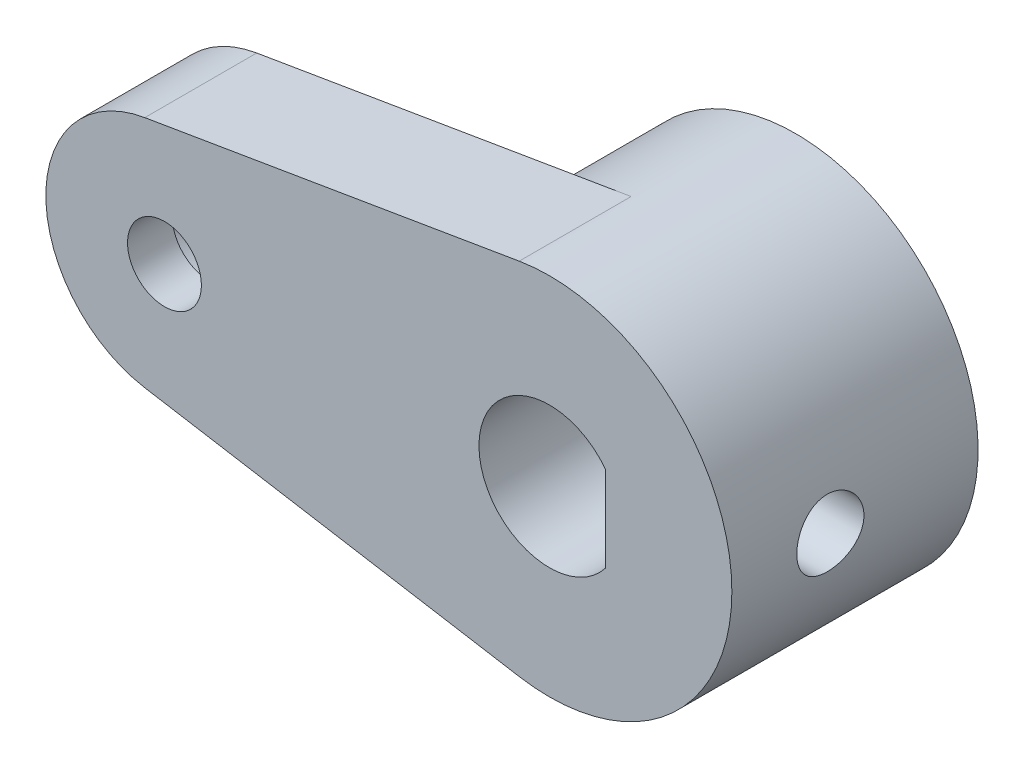
ISO-10303-21;
HEADER;
FILE_DESCRIPTION(('STEP AP214'),'2;1');
FILE_NAME('part.step','',(''),(''),'','','');
FILE_SCHEMA(('AUTOMOTIVE_DESIGN { 1 0 10303 214 1 1 1 1 }'));
ENDSEC;
DATA;
#1=APPLICATION_CONTEXT('core data for automotive mechanical design processes');
#2=APPLICATION_PROTOCOL_DEFINITION('international standard','automotive_design',2000,#1);
#3=PRODUCT_CONTEXT('',#1,'mechanical');
#4=PRODUCT('Part','Part','',(#3));
#5=PRODUCT_RELATED_PRODUCT_CATEGORY('part','',(#4));
#6=PRODUCT_DEFINITION_FORMATION('','',#4);
#7=PRODUCT_DEFINITION_CONTEXT('part definition',#1,'design');
#8=PRODUCT_DEFINITION('design','',#6,#7);
#9=PRODUCT_DEFINITION_SHAPE('','',#8);
#10=(LENGTH_UNIT() NAMED_UNIT(*) SI_UNIT(.MILLI.,.METRE.));
#11=(NAMED_UNIT(*) PLANE_ANGLE_UNIT() SI_UNIT($,.RADIAN.));
#12=(NAMED_UNIT(*) SI_UNIT($,.STERADIAN.) SOLID_ANGLE_UNIT());
#13=UNCERTAINTY_MEASURE_WITH_UNIT(LENGTH_MEASURE(1.E-05),#10,'distance_accuracy_value','');
#14=(GEOMETRIC_REPRESENTATION_CONTEXT(3) GLOBAL_UNCERTAINTY_ASSIGNED_CONTEXT((#13)) GLOBAL_UNIT_ASSIGNED_CONTEXT((#10,
#11,#12)) REPRESENTATION_CONTEXT('',''));
#15=CARTESIAN_POINT('',(0.,0.,0.));
#16=DIRECTION('',(0.,0.,1.));
#17=DIRECTION('',(1.,0.,0.));
#18=AXIS2_PLACEMENT_3D('',#15,#16,#17);
#19=CARTESIAN_POINT('',(-12.05,15.9999999999999,0.));
#20=DIRECTION('',(0.,0.,1.));
#21=DIRECTION('',(1.,0.,0.));
#22=AXIS2_PLACEMENT_3D('',#19,#20,#21);
#23=PLANE('',#22);
#24=CARTESIAN_POINT('',(-29.25,15.9999999999999,0.));
#25=DIRECTION('',(0.,0.,1.));
#26=DIRECTION('',(1.,0.,0.));
#27=AXIS2_PLACEMENT_3D('',#24,#25,#26);
#28=CIRCLE('',#27,1.65);
#29=CARTESIAN_POINT('',(-27.6,15.9999999999999,0.));
#30=VERTEX_POINT('',#29);
#31=EDGE_CURVE('E274',#30,#30,#28,.T.);
#32=ORIENTED_EDGE('',*,*,#31,.T.);
#33=EDGE_LOOP('',(#32));
#34=FACE_BOUND('',#33,.T.);
#35=CARTESIAN_POINT('',(-29.2499999999964,15.9999999999999,0.));
#36=DIRECTION('',(0.,0.,-1.));
#37=DIRECTION('',(-1.,0.,0.));
#38=AXIS2_PLACEMENT_3D('',#35,#36,#37);
#39=CIRCLE('',#38,2.9);
#40=CARTESIAN_POINT('',(-32.1499999999964,15.9999999999999,0.));
#41=VERTEX_POINT('',#40);
#42=EDGE_CURVE('E180',#41,#41,#39,.T.);
#43=ORIENTED_EDGE('',*,*,#42,.T.);
#44=EDGE_LOOP('',(#43));
#45=FACE_BOUND('',#44,.T.);
#46=ADVANCED_FACE('F36',(#34,#45),#23,.F.);
#47=CARTESIAN_POINT('',(-12.05,15.9999999999999,2.));
#48=DIRECTION('',(0.,0.,-1.));
#49=DIRECTION('',(-1.,0.,0.));
#50=AXIS2_PLACEMENT_3D('',#47,#48,#49);
#51=CYLINDRICAL_SURFACE('',#50,3.15);
#52=DIRECTION('',(0.,0.,-1.));
#53=VECTOR('',#52,1.);
#54=CARTESIAN_POINT('',(-11.55,19.1100643080166,2.));
#55=LINE('',#54,#53);
#56=CARTESIAN_POINT('',(-11.55,19.1100643080166,-1.98560429361376));
#57=VERTEX_POINT('',#56);
#58=CARTESIAN_POINT('',(-11.55,19.1100643080166,-2.81676591174198));
#59=VERTEX_POINT('',#58);
#60=EDGE_CURVE('E11',#57,#59,#55,.T.);
#61=ORIENTED_EDGE('',*,*,#60,.F.);
#62=CARTESIAN_POINT('',(-12.05,15.9999999999999,3.40118510267787));
#63=DIRECTION('',(0.,-0.866025403784438,-0.5));
#64=DIRECTION('',(0.,0.5,-0.866025403784438));
#65=AXIS2_PLACEMENT_3D('',#62,#63,#64);
#66=ELLIPSE('',#65,6.29999999999999,3.15);
#67=CARTESIAN_POINT('',(-9.55000000000003,17.9163767896735,0.0819231365173246));
#68=VERTEX_POINT('',#67);
#69=EDGE_CURVE('E556',#57,#68,#66,.T.);
#70=ORIENTED_EDGE('',*,*,#69,.T.);
#71=DIRECTION('',(0.,0.,1.));
#72=VECTOR('',#71,1.);
#73=CARTESIAN_POINT('',(-9.55000000000003,17.9163767896735,-13.0065565042295));
#74=LINE('',#73,#72);
#75=CARTESIAN_POINT('',(-9.55000000000003,17.9163767896735,2.));
#76=VERTEX_POINT('',#75);
#77=EDGE_CURVE('E59',#68,#76,#74,.T.);
#78=ORIENTED_EDGE('',*,*,#77,.T.);
#79=CARTESIAN_POINT('',(-12.05,15.9999999999999,2.));
#80=DIRECTION('',(0.,0.,1.));
#81=DIRECTION('',(1.,0.,0.));
#82=AXIS2_PLACEMENT_3D('',#79,#80,#81);
#83=CIRCLE('',#82,3.15);
#84=CARTESIAN_POINT('',(-9.55000000000002,14.0836232103262,2.));
#85=VERTEX_POINT('',#84);
#86=EDGE_CURVE('E518',#76,#85,#83,.T.);
#87=ORIENTED_EDGE('',*,*,#86,.T.);
#88=DIRECTION('',(0.,0.,1.));
#89=VECTOR('',#88,1.);
#90=CARTESIAN_POINT('',(-9.55000000000002,14.0836232103262,-13.0065565042295));
#91=LINE('',#90,#89);
#92=CARTESIAN_POINT('',(-9.55000000000002,14.0836232103262,0.0819231365173194));
#93=VERTEX_POINT('',#92);
#94=EDGE_CURVE('E554',#93,#85,#91,.T.);
#95=ORIENTED_EDGE('',*,*,#94,.F.);
#96=CARTESIAN_POINT('',(-12.05,15.9999999999999,3.40118510267786));
#97=DIRECTION('',(0.,0.866025403784438,-0.5));
#98=DIRECTION('',(0.,-0.5,-0.866025403784438));
#99=AXIS2_PLACEMENT_3D('',#96,#97,#98);
#100=ELLIPSE('',#99,6.29999999999999,3.15);
#101=CARTESIAN_POINT('',(-11.55,12.8899356919831,-1.98560429361376));
#102=VERTEX_POINT('',#101);
#103=EDGE_CURVE('E547',#93,#102,#100,.T.);
#104=ORIENTED_EDGE('',*,*,#103,.T.);
#105=DIRECTION('',(0.,0.,-1.));
#106=VECTOR('',#105,1.);
#107=CARTESIAN_POINT('',(-11.55,12.8899356919831,2.));
#108=LINE('',#107,#106);
#109=CARTESIAN_POINT('',(-11.55,12.8899356919831,-2.81676591174198));
#110=VERTEX_POINT('',#109);
#111=EDGE_CURVE('E44',#110,#102,#108,.F.);
#112=ORIENTED_EDGE('',*,*,#111,.F.);
#113=CARTESIAN_POINT('',(-12.05,15.9999999999999,-8.20355530803361));
#114=DIRECTION('',(0.,0.866025403784438,0.5));
#115=DIRECTION('',(0.,0.5,-0.866025403784438));
#116=AXIS2_PLACEMENT_3D('',#113,#114,#115);
#117=ELLIPSE('',#116,6.29999999999999,3.15);
#118=CARTESIAN_POINT('',(-9.55000000000002,14.0836232103262,-4.88429334187306));
#119=VERTEX_POINT('',#118);
#120=EDGE_CURVE('E555',#110,#119,#117,.T.);
#121=ORIENTED_EDGE('',*,*,#120,.T.);
#122=CARTESIAN_POINT('',(-9.55000000000002,14.0836232103262,-9.));
#123=VERTEX_POINT('',#122);
#124=EDGE_CURVE('E569',#123,#119,#91,.T.);
#125=ORIENTED_EDGE('',*,*,#124,.F.);
#126=CARTESIAN_POINT('',(-12.05,15.9999999999999,-9.));
#127=DIRECTION('',(0.,0.,-1.));
#128=DIRECTION('',(-1.,0.,0.));
#129=AXIS2_PLACEMENT_3D('',#126,#127,#128);
#130=CIRCLE('',#129,3.15);
#131=CARTESIAN_POINT('',(-9.55000000000002,17.9163767896735,-9.));
#132=VERTEX_POINT('',#131);
#133=EDGE_CURVE('E161',#123,#132,#130,.T.);
#134=ORIENTED_EDGE('',*,*,#133,.T.);
#135=CARTESIAN_POINT('',(-9.55000000000003,17.9163767896735,-4.88429334187307));
#136=VERTEX_POINT('',#135);
#137=EDGE_CURVE('E566',#132,#136,#74,.T.);
#138=ORIENTED_EDGE('',*,*,#137,.T.);
#139=CARTESIAN_POINT('',(-12.05,15.9999999999999,-8.20355530803362));
#140=DIRECTION('',(0.,-0.866025403784439,0.5));
#141=DIRECTION('',(0.,-0.5,-0.866025403784439));
#142=AXIS2_PLACEMENT_3D('',#139,#140,#141);
#143=ELLIPSE('',#142,6.3,3.15);
#144=EDGE_CURVE('E51',#136,#59,#143,.T.);
#145=ORIENTED_EDGE('',*,*,#144,.T.);
#146=EDGE_LOOP('',(#61,#70,#78,#87,#95,#104,#112,#121,#125,#134,#138,#145));
#147=FACE_BOUND('',#146,.T.);
#148=ADVANCED_FACE('F243',(#147),#51,.F.);
#149=CARTESIAN_POINT('',(-9.55000000000003,17.9163767896735,-13.0065565042295));
#150=DIRECTION('',(-1.,0.,0.));
#151=DIRECTION('',(0.,-1.,0.));
#152=AXIS2_PLACEMENT_3D('',#149,#150,#151);
#153=PLANE('',#152);
#154=DIRECTION('',(0.,-1.,0.));
#155=VECTOR('',#154,1.);
#156=CARTESIAN_POINT('',(-9.55000000000003,17.9163767896735,0.5));
#157=LINE('',#156,#155);
#158=CARTESIAN_POINT('',(-9.55000000000002,17.6749999999999,0.5));
#159=VERTEX_POINT('',#158);
#160=CARTESIAN_POINT('',(-9.55000000000002,14.3249999999999,0.5));
#161=VERTEX_POINT('',#160);
#162=EDGE_CURVE('E532',#159,#161,#157,.T.);
#163=ORIENTED_EDGE('',*,*,#162,.T.);
#164=DIRECTION('',(0.,-0.5,-0.866025403784438));
#165=VECTOR('',#164,1.);
#166=CARTESIAN_POINT('',(-9.55000000000002,9.37433367226192,-8.07480561096254));
#167=LINE('',#166,#165);
#168=EDGE_CURVE('E535',#161,#93,#167,.T.);
#169=ORIENTED_EDGE('',*,*,#168,.T.);
#170=ORIENTED_EDGE('',*,*,#94,.T.);
#171=DIRECTION('',(0.,-1.,0.));
#172=VECTOR('',#171,1.);
#173=CARTESIAN_POINT('',(-9.55000000000003,17.9163767896735,2.));
#174=LINE('',#173,#172);
#175=EDGE_CURVE('E493',#76,#85,#174,.T.);
#176=ORIENTED_EDGE('',*,*,#175,.F.);
#177=ORIENTED_EDGE('',*,*,#77,.F.);
#178=DIRECTION('',(0.,-0.5,0.866025403784439));
#179=VECTOR('',#178,1.);
#180=CARTESIAN_POINT('',(-9.55000000000003,23.5838547225746,-9.73443659404281));
#181=LINE('',#180,#179);
#182=EDGE_CURVE('E529',#68,#159,#181,.T.);
#183=ORIENTED_EDGE('',*,*,#182,.T.);
#184=EDGE_LOOP('',(#163,#169,#170,#176,#177,#183));
#185=FACE_BOUND('',#184,.T.);
#186=ADVANCED_FACE('F239',(#185),#153,.T.);
#187=ORIENTED_EDGE('',*,*,#124,.T.);
#188=DIRECTION('',(0.,0.5,-0.866025403784439));
#189=VECTOR('',#188,1.);
#190=CARTESIAN_POINT('',(-9.55000000000003,18.5588547225746,-12.6356216967207));
#191=LINE('',#190,#189);
#192=CARTESIAN_POINT('',(-9.55000000000002,14.3249999999999,-5.30237020535574));
#193=VERTEX_POINT('',#192);
#194=EDGE_CURVE('E526',#119,#193,#191,.T.);
#195=ORIENTED_EDGE('',*,*,#194,.T.);
#196=DIRECTION('',(0.,1.,0.));
#197=VECTOR('',#196,1.);
#198=CARTESIAN_POINT('',(-9.55000000000003,17.9163767896735,-5.30237020535574));
#199=LINE('',#198,#197);
#200=CARTESIAN_POINT('',(-9.55000000000003,17.6749999999999,-5.30237020535574));
#201=VERTEX_POINT('',#200);
#202=EDGE_CURVE('E523',#193,#201,#199,.T.);
#203=ORIENTED_EDGE('',*,*,#202,.T.);
#204=DIRECTION('',(0.,0.5,0.866025403784439));
#205=VECTOR('',#204,1.);
#206=CARTESIAN_POINT('',(-9.55000000000002,14.3993336722619,-10.9759907136404));
#207=LINE('',#206,#205);
#208=EDGE_CURVE('E521',#201,#136,#207,.T.);
#209=ORIENTED_EDGE('',*,*,#208,.T.);
#210=ORIENTED_EDGE('',*,*,#137,.F.);
#211=DIRECTION('',(0.,-1.,0.));
#212=VECTOR('',#211,1.);
#213=CARTESIAN_POINT('',(-9.55000000000003,17.9163767896735,-9.));
#214=LINE('',#213,#212);
#215=EDGE_CURVE('E563',#132,#123,#214,.T.);
#216=ORIENTED_EDGE('',*,*,#215,.T.);
#217=EDGE_LOOP('',(#187,#195,#203,#209,#210,#216));
#218=FACE_BOUND('',#217,.T.);
#219=ADVANCED_FACE('F242',(#218),#153,.T.);
#220=CARTESIAN_POINT('',(-12.05,15.9999999999999,2.));
#221=DIRECTION('',(0.,0.,1.));
#222=DIRECTION('',(1.,0.,0.));
#223=AXIS2_PLACEMENT_3D('',#220,#221,#222);
#224=PLANE('',#223);
#225=ORIENTED_EDGE('',*,*,#175,.T.);
#226=ORIENTED_EDGE('',*,*,#86,.F.);
#227=EDGE_LOOP('',(#225,#226));
#228=FACE_BOUND('',#227,.T.);
#229=CARTESIAN_POINT('',(-29.25,15.9999999999999,2.));
#230=DIRECTION('',(0.,0.,1.));
#231=DIRECTION('',(1.,0.,0.));
#232=AXIS2_PLACEMENT_3D('',#229,#230,#231);
#233=CIRCLE('',#232,1.65);
#234=CARTESIAN_POINT('',(-27.6,15.9999999999999,2.));
#235=VERTEX_POINT('',#234);
#236=EDGE_CURVE('E497',#235,#235,#233,.T.);
#237=ORIENTED_EDGE('',*,*,#236,.F.);
#238=EDGE_LOOP('',(#237));
#239=FACE_BOUND('',#238,.T.);
#240=DIRECTION('',(-0.986176597112467,-0.165697674418428,0.));
#241=VECTOR('',#240,1.);
#242=CARTESIAN_POINT('',(-30.1281976744146,21.2267359646995,2.));
#243=LINE('',#242,#241);
#244=CARTESIAN_POINT('',(-13.4004360465102,24.0373392664665,2.));
#245=VERTEX_POINT('',#244);
#246=CARTESIAN_POINT('',(-30.1281976744146,21.2267359646995,2.));
#247=VERTEX_POINT('',#246);
#248=EDGE_CURVE('E499',#245,#247,#243,.T.);
#249=ORIENTED_EDGE('',*,*,#248,.T.);
#250=CARTESIAN_POINT('',(-29.2499999999964,15.9999999999999,2.));
#251=DIRECTION('',(0.,0.,1.));
#252=DIRECTION('',(1.,0.,0.));
#253=AXIS2_PLACEMENT_3D('',#250,#251,#252);
#254=CIRCLE('',#253,5.30000000000366);
#255=CARTESIAN_POINT('',(-30.1281976744146,10.7732640353002,2.));
#256=VERTEX_POINT('',#255);
#257=EDGE_CURVE('E157',#247,#256,#254,.T.);
#258=ORIENTED_EDGE('',*,*,#257,.T.);
#259=DIRECTION('',(0.986176597112467,-0.165697674418428,0.));
#260=VECTOR('',#259,1.);
#261=CARTESIAN_POINT('',(-30.1281976744146,10.7732640353002,2.));
#262=LINE('',#261,#260);
#263=CARTESIAN_POINT('',(-13.4004360465102,7.96266073353325,2.));
#264=VERTEX_POINT('',#263);
#265=EDGE_CURVE('E506',#256,#264,#262,.T.);
#266=ORIENTED_EDGE('',*,*,#265,.T.);
#267=CARTESIAN_POINT('',(-12.05,15.9999999999999,2.));
#268=DIRECTION('',(0.,0.,1.));
#269=DIRECTION('',(1.,0.,0.));
#270=AXIS2_PLACEMENT_3D('',#267,#268,#269);
#271=CIRCLE('',#270,8.15);
#272=EDGE_CURVE('E501',#264,#245,#271,.T.);
#273=ORIENTED_EDGE('',*,*,#272,.T.);
#274=EDGE_LOOP('',(#249,#258,#266,#273));
#275=FACE_BOUND('',#274,.T.);
#276=ADVANCED_FACE('F261',(#228,#239,#275),#224,.T.);
#277=CARTESIAN_POINT('',(-29.25,15.9999999999999,2.));
#278=DIRECTION('',(0.,0.,-1.));
#279=DIRECTION('',(-1.,0.,0.));
#280=AXIS2_PLACEMENT_3D('',#277,#278,#279);
#281=CYLINDRICAL_SURFACE('',#280,1.65);
#282=ORIENTED_EDGE('',*,*,#236,.T.);
#283=EDGE_LOOP('',(#282));
#284=FACE_BOUND('',#283,.T.);
#285=ORIENTED_EDGE('',*,*,#31,.F.);
#286=EDGE_LOOP('',(#285));
#287=FACE_BOUND('',#286,.T.);
#288=ADVANCED_FACE('F254',(#284,#287),#281,.F.);
#289=CARTESIAN_POINT('',(-12.05,15.9999999999999,-9.));
#290=DIRECTION('',(0.,0.,-1.));
#291=DIRECTION('',(-1.,0.,0.));
#292=AXIS2_PLACEMENT_3D('',#289,#290,#291);
#293=PLANE('',#292);
#294=ORIENTED_EDGE('',*,*,#133,.F.);
#295=ORIENTED_EDGE('',*,*,#215,.F.);
#296=EDGE_LOOP('',(#294,#295));
#297=FACE_BOUND('',#296,.T.);
#298=CARTESIAN_POINT('',(-12.05,15.9999999999999,-9.));
#299=DIRECTION('',(0.,0.,-1.));
#300=DIRECTION('',(-1.,0.,0.));
#301=AXIS2_PLACEMENT_3D('',#298,#299,#300);
#302=CIRCLE('',#301,8.15);
#303=CARTESIAN_POINT('',(-20.2,15.9999999999999,-9.));
#304=VERTEX_POINT('',#303);
#305=EDGE_CURVE('E514',#304,#304,#302,.T.);
#306=ORIENTED_EDGE('',*,*,#305,.T.);
#307=EDGE_LOOP('',(#306));
#308=FACE_BOUND('',#307,.T.);
#309=ADVANCED_FACE('F252',(#297,#308),#293,.T.);
#310=CARTESIAN_POINT('',(-12.05,15.9999999999999,-9.));
#311=DIRECTION('',(0.,0.,1.));
#312=DIRECTION('',(1.,0.,0.));
#313=AXIS2_PLACEMENT_3D('',#310,#311,#312);
#314=CYLINDRICAL_SURFACE('',#313,8.15);
#315=CARTESIAN_POINT('',(-3.90000000000003,15.9999999999999,-0.901185102677868));
#316=CARTESIAN_POINT('',(-3.90000150167809,16.0834999719523,-0.901188322725902));
#317=CARTESIAN_POINT('',(-3.90129650509804,16.1670421650003,-0.90818090778598));
#318=CARTESIAN_POINT('',(-3.90633773160013,16.3317742979751,-0.935949592559351));
#319=CARTESIAN_POINT('',(-3.91008605555952,16.4129621595087,-0.956737505980861));
#320=CARTESIAN_POINT('',(-3.91961443000065,16.5705792536173,-1.01144034583224));
#321=CARTESIAN_POINT('',(-3.92539267495041,16.6470126442196,-1.04534360939511));
#322=CARTESIAN_POINT('',(-3.93834916125274,16.7930987533541,-1.12528208664702));
#323=CARTESIAN_POINT('',(-3.94552728123304,16.8627520589507,-1.17131624868158));
#324=CARTESIAN_POINT('',(-3.96058339679683,16.9941133715935,-1.27477479135112));
#325=CARTESIAN_POINT('',(-3.96846786786568,17.0557316712563,-1.33231214291569));
#326=CARTESIAN_POINT('',(-3.98399973854177,17.1684979939135,-1.45690074204362));
#327=CARTESIAN_POINT('',(-3.99164712146171,17.2196452813255,-1.52395265743959));
#328=CARTESIAN_POINT('',(-4.00590184077009,17.3103884762606,-1.66629795639434));
#329=CARTESIAN_POINT('',(-4.01250082434424,17.3498935670821,-1.74165014433616));
#330=CARTESIAN_POINT('',(-4.02382056710147,17.415649701498,-1.8980634350691));
#331=CARTESIAN_POINT('',(-4.02854148208289,17.4419018445616,-1.97912406365002));
#332=CARTESIAN_POINT('',(-4.03550550541197,17.4801198772097,-2.14369484968453));
#333=CARTESIAN_POINT('',(-4.03777568116387,17.4922419494153,-2.22716756917353));
#334=CARTESIAN_POINT('',(-4.03966283830762,17.5023404295669,-2.39499060635379));
#335=CARTESIAN_POINT('',(-4.03928004885564,17.5003180592726,-2.47934084761859));
#336=CARTESIAN_POINT('',(-4.03592918196163,17.4823118047393,-2.64539591422444));
#337=CARTESIAN_POINT('',(-4.03299392246768,17.4665051423934,-2.72712071651006));
#338=CARTESIAN_POINT('',(-4.0249203619652,17.4216579254086,-2.88673830198863));
#339=CARTESIAN_POINT('',(-4.01978197044483,17.3926168270527,-2.96463092759667));
#340=CARTESIAN_POINT('',(-4.00784660739547,17.321950695513,-3.114893693632));
#341=CARTESIAN_POINT('',(-4.0010402018971,17.2802537515543,-3.18722923533145));
#342=CARTESIAN_POINT('',(-3.9865420112001,17.1855104429686,-3.32394374895626));
#343=CARTESIAN_POINT('',(-3.97885013935301,17.1324629671833,-3.38832194092424));
#344=CARTESIAN_POINT('',(-3.96330448751307,17.0155671635836,-3.50831857262328));
#345=CARTESIAN_POINT('',(-3.95545002169626,16.95156716881,-3.56378928156863));
#346=CARTESIAN_POINT('',(-3.9405715421363,16.8150914972424,-3.66322876577628));
#347=CARTESIAN_POINT('',(-3.93354753615391,16.7426157412539,-3.70719743355516));
#348=CARTESIAN_POINT('',(-3.92110798508839,16.5910944063069,-3.7824050374908));
#349=CARTESIAN_POINT('',(-3.91569433264208,16.5120412354466,-3.81362901080879));
#350=CARTESIAN_POINT('',(-3.90710017149128,16.3496903050469,-3.86231366665702));
#351=CARTESIAN_POINT('',(-3.90391943434988,16.2663929806382,-3.87977575710998));
#352=CARTESIAN_POINT('',(-3.90018074985654,16.0991896281983,-3.90023626723037));
#353=CARTESIAN_POINT('',(-3.89958608834384,16.0153091714377,-3.90343716720366));
#354=CARTESIAN_POINT('',(-3.90098529045583,15.8482114438583,-3.8958269931672));
#355=CARTESIAN_POINT('',(-3.90297903172463,15.7649941418788,-3.88501658148351));
#356=CARTESIAN_POINT('',(-3.90930818295147,15.6022242831328,-3.84985901232437));
#357=CARTESIAN_POINT('',(-3.91362592890361,15.5226489326112,-3.82561392696889));
#358=CARTESIAN_POINT('',(-3.92412096205267,15.3686924998488,-3.76438541096201));
#359=CARTESIAN_POINT('',(-3.93029837187708,15.2943117605428,-3.72740114025691));
#360=CARTESIAN_POINT('',(-3.94391906504554,15.1519891328301,-3.64129325628093));
#361=CARTESIAN_POINT('',(-3.95137504065441,15.0841236284461,-3.5920454406919));
#362=CARTESIAN_POINT('',(-3.96669219217131,14.9575475119615,-3.48297697692626));
#363=CARTESIAN_POINT('',(-3.97455340439717,14.8988377223123,-3.42315537994278));
#364=CARTESIAN_POINT('',(-3.98991629270946,14.7914734437971,-3.29372223011895));
#365=CARTESIAN_POINT('',(-3.99741209701598,14.7429569052515,-3.22399543616544));
#366=CARTESIAN_POINT('',(-4.01107881149139,14.6583251099296,-3.07726263539186));
#367=CARTESIAN_POINT('',(-4.01724976976286,14.6222094028746,-3.00025689300257));
#368=CARTESIAN_POINT('',(-4.02752235676783,14.5636019231625,-2.84150846224709));
#369=CARTESIAN_POINT('',(-4.0316337161989,14.5410459834144,-2.75979012231365));
#370=CARTESIAN_POINT('',(-4.03734422431514,14.5099996684003,-2.59364110751018));
#371=CARTESIAN_POINT('',(-4.03894364494204,14.5015077705599,-2.50921072725485));
#372=CARTESIAN_POINT('',(-4.0394357435963,14.4988800852506,-2.3414153254065));
#373=CARTESIAN_POINT('',(-4.03836943279642,14.5045267834417,-2.258053752388));
#374=CARTESIAN_POINT('',(-4.03374096946467,14.5295408069285,-2.09348950000944));
#375=CARTESIAN_POINT('',(-4.03017883056898,14.5489080572608,-2.01228680885664));
#376=CARTESIAN_POINT('',(-4.02097705693766,14.6007230762182,-1.85445668573634));
#377=CARTESIAN_POINT('',(-4.0153410324409,14.6331481229182,-1.77782157028041));
#378=CARTESIAN_POINT('',(-4.00262382455314,14.7101347926261,-1.63104429947456));
#379=CARTESIAN_POINT('',(-3.99554254424236,14.7546972296425,-1.56090258003481));
#380=CARTESIAN_POINT('',(-3.98060492520012,14.855453424119,-1.42801193837048));
#381=CARTESIAN_POINT('',(-3.97273887416987,14.9118057915551,-1.36538434409657));
#382=CARTESIAN_POINT('',(-3.95719149494632,15.0342107302245,-1.25040133937035));
#383=CARTESIAN_POINT('',(-3.94951020961887,15.1002655276476,-1.19804829283591));
#384=CARTESIAN_POINT('',(-3.93512023969835,15.240882272339,-1.10467995277805));
#385=CARTESIAN_POINT('',(-3.92842051787249,15.3155126977188,-1.0637663715275));
#386=CARTESIAN_POINT('',(-3.91683596461757,15.4706861539657,-0.995123053391726));
#387=CARTESIAN_POINT('',(-3.91194941146998,15.5512234883446,-0.967380802458702));
#388=CARTESIAN_POINT('',(-3.90555029374123,15.6933428536973,-0.931568498603946));
#389=CARTESIAN_POINT('',(-3.90348057740863,15.7540886808239,-0.920193981150005));
#390=CARTESIAN_POINT('',(-3.90070489166182,15.8765486604609,-0.905001182936311));
#391=CARTESIAN_POINT('',(-3.89999888970727,15.9382627898308,-0.901182721877281));
#392=CARTESIAN_POINT('',(-3.90000000000003,15.9999999999999,-0.901185102677868));
#393=B_SPLINE_CURVE_WITH_KNOTS('',3,(#315,#316,#317,#318,#319,#320,#321,#322,#323,#324,#325,
#326,#327,#328,#329,#330,#331,#332,#333,#334,#335,#336,#337,#338,#339,#340,#341,#342,#343,#344,
#345,#346,#347,#348,#349,#350,#351,#352,#353,#354,#355,#356,#357,#358,#359,#360,#361,#362,#363,
#364,#365,#366,#367,#368,#369,#370,#371,#372,#373,#374,#375,#376,#377,#378,#379,#380,#381,#382,
#383,#384,#385,#386,#387,#388,#389,#390,#391,#392),.UNSPECIFIED.,.T.,.F.,(4,2,2,2,2,2,2,2,2,2,2,
2,2,2,2,2,2,2,2,2,2,2,2,2,2,2,2,2,2,2,2,2,2,2,2,2,2,2,4),(0.,0.250274158333465,0.50076291741831,
0.751029438720307,1.00127427099657,1.25410946004426,1.50696240452334,1.76173850691448,
2.01649346951632,2.26840503907194,2.52029484943872,2.76899312850183,3.01770162588155,
3.2678506200077,3.51802411363497,3.77199344116229,4.02596514187882,4.28023416491441,
4.53447717133379,4.78509869140867,5.0357083648331,5.2844395918825,5.53318722403135,
5.78456459022264,6.03596452447694,6.29057418651334,6.54517460260225,6.79856052368634,
7.05191901139578,7.30140374338904,7.55088711230999,7.79993821722714,8.04900602916519,
8.30166907009888,8.5543901745395,8.80929160914457,9.0639503754814,9.24899950370552,
9.43404421631587),.UNSPECIFIED.);
#394=CARTESIAN_POINT('',(-3.90000000000003,15.9999999999999,-0.901185102677868));
#395=VERTEX_POINT('',#394);
#396=EDGE_CURVE('E186',#395,#395,#393,.T.);
#397=ORIENTED_EDGE('',*,*,#396,.T.);
#398=EDGE_LOOP('',(#397));
#399=FACE_BOUND('',#398,.T.);
#400=CARTESIAN_POINT('',(-12.05,15.9999999999999,-3.));
#401=DIRECTION('',(0.,0.,1.));
#402=DIRECTION('',(-1.,0.,0.));
#403=AXIS2_PLACEMENT_3D('',#400,#401,#402);
#404=CIRCLE('',#403,8.15);
#405=CARTESIAN_POINT('',(-13.4004360465102,24.0373392664665,-3.));
#406=VERTEX_POINT('',#405);
#407=CARTESIAN_POINT('',(-13.4004360465102,7.96266073353325,-3.));
#408=VERTEX_POINT('',#407);
#409=EDGE_CURVE('E170',#406,#408,#404,.T.);
#410=ORIENTED_EDGE('',*,*,#409,.F.);
#411=DIRECTION('',(0.,0.,1.));
#412=VECTOR('',#411,1.);
#413=CARTESIAN_POINT('',(-13.4004360465102,24.0373392664665,-9.));
#414=LINE('',#413,#412);
#415=EDGE_CURVE('E162',#406,#245,#414,.T.);
#416=ORIENTED_EDGE('',*,*,#415,.T.);
#417=ORIENTED_EDGE('',*,*,#272,.F.);
#418=DIRECTION('',(0.,0.,1.));
#419=VECTOR('',#418,1.);
#420=CARTESIAN_POINT('',(-13.4004360465102,7.96266073353325,-9.));
#421=LINE('',#420,#419);
#422=EDGE_CURVE('E504',#408,#264,#421,.T.);
#423=ORIENTED_EDGE('',*,*,#422,.F.);
#424=EDGE_LOOP('',(#410,#416,#417,#423));
#425=FACE_BOUND('',#424,.T.);
#426=ORIENTED_EDGE('',*,*,#305,.F.);
#427=EDGE_LOOP('',(#426));
#428=FACE_BOUND('',#427,.T.);
#429=ADVANCED_FACE('F196',(#399,#425,#428),#314,.T.);
#430=CARTESIAN_POINT('',(-29.2499999999964,15.9999999999999,-9.));
#431=DIRECTION('',(0.,0.,1.));
#432=DIRECTION('',(1.,0.,0.));
#433=AXIS2_PLACEMENT_3D('',#430,#431,#432);
#434=CYLINDRICAL_SURFACE('',#433,5.30000000000366);
#435=DIRECTION('',(0.,0.,1.));
#436=VECTOR('',#435,1.);
#437=CARTESIAN_POINT('',(-30.1281976744146,21.2267359646995,-9.));
#438=LINE('',#437,#436);
#439=CARTESIAN_POINT('',(-30.1281976744146,21.2267359646995,-3.));
#440=VERTEX_POINT('',#439);
#441=EDGE_CURVE('E151',#440,#247,#438,.T.);
#442=ORIENTED_EDGE('',*,*,#441,.F.);
#443=CARTESIAN_POINT('',(-29.2499999999964,15.9999999999999,-3.));
#444=DIRECTION('',(0.,0.,-1.));
#445=DIRECTION('',(-1.,0.,0.));
#446=AXIS2_PLACEMENT_3D('',#443,#444,#445);
#447=CIRCLE('',#446,5.30000000000366);
#448=CARTESIAN_POINT('',(-30.1281976744146,10.7732640353002,-3.));
#449=VERTEX_POINT('',#448);
#450=EDGE_CURVE('E156',#449,#440,#447,.T.);
#451=ORIENTED_EDGE('',*,*,#450,.F.);
#452=DIRECTION('',(0.,0.,1.));
#453=VECTOR('',#452,1.);
#454=CARTESIAN_POINT('',(-30.1281976744146,10.7732640353002,-9.));
#455=LINE('',#454,#453);
#456=EDGE_CURVE('E502',#449,#256,#455,.T.);
#457=ORIENTED_EDGE('',*,*,#456,.T.);
#458=ORIENTED_EDGE('',*,*,#257,.F.);
#459=EDGE_LOOP('',(#442,#451,#457,#458));
#460=FACE_BOUND('',#459,.T.);
#461=ADVANCED_FACE('F153',(#460),#434,.T.);
#462=CARTESIAN_POINT('',(-30.1281976744146,21.2267359646995,-9.));
#463=DIRECTION('',(-0.165697674418428,0.986176597112467,0.));
#464=DIRECTION('',(-0.986176597112467,-0.165697674418428,0.));
#465=AXIS2_PLACEMENT_3D('',#462,#463,#464);
#466=PLANE('',#465);
#467=ORIENTED_EDGE('',*,*,#415,.F.);
#468=DIRECTION('',(0.986176597112467,0.165697674418428,0.));
#469=VECTOR('',#468,1.);
#470=CARTESIAN_POINT('',(-30.1281976744146,21.2267359646995,-3.));
#471=LINE('',#470,#469);
#472=EDGE_CURVE('E165',#440,#406,#471,.T.);
#473=ORIENTED_EDGE('',*,*,#472,.F.);
#474=ORIENTED_EDGE('',*,*,#441,.T.);
#475=ORIENTED_EDGE('',*,*,#248,.F.);
#476=EDGE_LOOP('',(#467,#473,#474,#475));
#477=FACE_BOUND('',#476,.T.);
#478=ADVANCED_FACE('F166',(#477),#466,.T.);
#479=CARTESIAN_POINT('',(-30.1281976744146,10.7732640353002,-9.));
#480=DIRECTION('',(-0.165697674418428,-0.986176597112467,0.));
#481=DIRECTION('',(0.986176597112467,-0.165697674418428,0.));
#482=AXIS2_PLACEMENT_3D('',#479,#480,#481);
#483=PLANE('',#482);
#484=ORIENTED_EDGE('',*,*,#456,.F.);
#485=DIRECTION('',(-0.986176597112467,0.165697674418428,0.));
#486=VECTOR('',#485,1.);
#487=CARTESIAN_POINT('',(-13.4004360465102,7.96266073353325,-3.));
#488=LINE('',#487,#486);
#489=EDGE_CURVE('E176',#408,#449,#488,.T.);
#490=ORIENTED_EDGE('',*,*,#489,.F.);
#491=ORIENTED_EDGE('',*,*,#422,.T.);
#492=ORIENTED_EDGE('',*,*,#265,.F.);
#493=EDGE_LOOP('',(#484,#490,#491,#492));
#494=FACE_BOUND('',#493,.T.);
#495=ADVANCED_FACE('F247',(#494),#483,.T.);
#496=CARTESIAN_POINT('',(-11.55,0.,0.));
#497=DIRECTION('',(-1.,0.,0.));
#498=DIRECTION('',(0.,-1.,0.));
#499=AXIS2_PLACEMENT_3D('',#496,#497,#498);
#500=PLANE('',#499);
#501=ORIENTED_EDGE('',*,*,#60,.T.);
#502=DIRECTION('',(0.,-0.5,-0.866025403784439));
#503=VECTOR('',#502,1.);
#504=CARTESIAN_POINT('',(-11.55,14.3993336722619,-10.9759907136404));
#505=LINE('',#504,#503);
#506=CARTESIAN_POINT('',(-11.55,19.3499999999999,-2.40118510267787));
#507=VERTEX_POINT('',#506);
#508=EDGE_CURVE('E600',#507,#59,#505,.T.);
#509=ORIENTED_EDGE('',*,*,#508,.F.);
#510=DIRECTION('',(0.,0.5,-0.866025403784438));
#511=VECTOR('',#510,1.);
#512=CARTESIAN_POINT('',(-11.55,23.5838547225746,-9.73443659404281));
#513=LINE('',#512,#511);
#514=EDGE_CURVE('E550',#57,#507,#513,.T.);
#515=ORIENTED_EDGE('',*,*,#514,.F.);
#516=EDGE_LOOP('',(#501,#509,#515));
#517=FACE_BOUND('',#516,.T.);
#518=ADVANCED_FACE('F216',(#517),#500,.F.);
#519=CARTESIAN_POINT('',(-11.55,17.9163767896735,-5.30237020535574));
#520=DIRECTION('',(0.,0.,1.));
#521=DIRECTION('',(0.,-1.,0.));
#522=AXIS2_PLACEMENT_3D('',#519,#520,#521);
#523=PLANE('',#522);
#524=DIRECTION('',(1.,0.,0.));
#525=VECTOR('',#524,1.);
#526=CARTESIAN_POINT('',(-11.55,14.3249999999999,-5.30237020535574));
#527=LINE('',#526,#525);
#528=CARTESIAN_POINT('',(-6.75000000000002,14.3249999999999,-5.30237020535574));
#529=VERTEX_POINT('',#528);
#530=EDGE_CURVE('E585',#193,#529,#527,.T.);
#531=ORIENTED_EDGE('',*,*,#530,.T.);
#532=DIRECTION('',(0.,-1.,0.));
#533=VECTOR('',#532,1.);
#534=CARTESIAN_POINT('',(-6.75000000000002,17.9163767896735,-5.30237020535574));
#535=LINE('',#534,#533);
#536=CARTESIAN_POINT('',(-6.75000000000002,17.6749999999999,-5.30237020535574));
#537=VERTEX_POINT('',#536);
#538=EDGE_CURVE('E194',#537,#529,#535,.T.);
#539=ORIENTED_EDGE('',*,*,#538,.F.);
#540=DIRECTION('',(1.,0.,0.));
#541=VECTOR('',#540,1.);
#542=CARTESIAN_POINT('',(-11.55,17.6749999999999,-5.30237020535574));
#543=LINE('',#542,#541);
#544=EDGE_CURVE('E595',#201,#537,#543,.T.);
#545=ORIENTED_EDGE('',*,*,#544,.F.);
#546=ORIENTED_EDGE('',*,*,#202,.F.);
#547=EDGE_LOOP('',(#531,#539,#545,#546));
#548=FACE_BOUND('',#547,.T.);
#549=ADVANCED_FACE('F234',(#548),#523,.T.);
#550=CARTESIAN_POINT('',(-11.55,18.5588547225746,-12.6356216967207));
#551=DIRECTION('',(0.,0.866025403784438,0.5));
#552=DIRECTION('',(0.,-0.5,0.866025403784438));
#553=AXIS2_PLACEMENT_3D('',#550,#551,#552);
#554=PLANE('',#553);
#555=DIRECTION('',(0.,-0.5,0.866025403784438));
#556=VECTOR('',#555,1.);
#557=CARTESIAN_POINT('',(-11.55,18.5588547225746,-12.6356216967207));
#558=LINE('',#557,#556);
#559=CARTESIAN_POINT('',(-11.55,12.6499999999999,-2.40118510267787));
#560=VERTEX_POINT('',#559);
#561=EDGE_CURVE('E543',#110,#560,#558,.T.);
#562=ORIENTED_EDGE('',*,*,#561,.T.);
#563=DIRECTION('',(1.,0.,0.));
#564=VECTOR('',#563,1.);
#565=CARTESIAN_POINT('',(-11.55,12.6499999999999,-2.40118510267787));
#566=LINE('',#565,#564);
#567=CARTESIAN_POINT('',(-6.75000000000002,12.6499999999999,-2.40118510267787));
#568=VERTEX_POINT('',#567);
#569=EDGE_CURVE('E549',#560,#568,#566,.T.);
#570=ORIENTED_EDGE('',*,*,#569,.T.);
#571=DIRECTION('',(0.,-0.5,0.866025403784438));
#572=VECTOR('',#571,1.);
#573=CARTESIAN_POINT('',(-6.75000000000002,18.5588547225746,-12.6356216967207));
#574=LINE('',#573,#572);
#575=EDGE_CURVE('E613',#529,#568,#574,.T.);
#576=ORIENTED_EDGE('',*,*,#575,.F.);
#577=ORIENTED_EDGE('',*,*,#530,.F.);
#578=ORIENTED_EDGE('',*,*,#194,.F.);
#579=ORIENTED_EDGE('',*,*,#120,.F.);
#580=EDGE_LOOP('',(#562,#570,#576,#577,#578,#579));
#581=FACE_BOUND('',#580,.T.);
#582=ADVANCED_FACE('F230',(#581),#554,.T.);
#583=CARTESIAN_POINT('',(-11.55,9.37433367226192,-8.07480561096254));
#584=DIRECTION('',(0.,0.866025403784438,-0.5));
#585=DIRECTION('',(0.,0.5,0.866025403784438));
#586=AXIS2_PLACEMENT_3D('',#583,#584,#585);
#587=PLANE('',#586);
#588=ORIENTED_EDGE('',*,*,#168,.F.);
#589=DIRECTION('',(1.,0.,0.));
#590=VECTOR('',#589,1.);
#591=CARTESIAN_POINT('',(-11.55,14.3249999999999,0.5));
#592=LINE('',#591,#590);
#593=CARTESIAN_POINT('',(-6.75000000000002,14.3249999999999,0.5));
#594=VERTEX_POINT('',#593);
#595=EDGE_CURVE('E577',#161,#594,#592,.T.);
#596=ORIENTED_EDGE('',*,*,#595,.T.);
#597=DIRECTION('',(0.,0.5,0.866025403784438));
#598=VECTOR('',#597,1.);
#599=CARTESIAN_POINT('',(-6.75000000000002,9.37433367226192,-8.07480561096254));
#600=LINE('',#599,#598);
#601=EDGE_CURVE('E612',#568,#594,#600,.T.);
#602=ORIENTED_EDGE('',*,*,#601,.F.);
#603=ORIENTED_EDGE('',*,*,#569,.F.);
#604=DIRECTION('',(0.,0.5,0.866025403784438));
#605=VECTOR('',#604,1.);
#606=CARTESIAN_POINT('',(-11.55,9.37433367226192,-8.07480561096254));
#607=LINE('',#606,#605);
#608=EDGE_CURVE('E542',#560,#102,#607,.T.);
#609=ORIENTED_EDGE('',*,*,#608,.T.);
#610=ORIENTED_EDGE('',*,*,#103,.F.);
#611=EDGE_LOOP('',(#588,#596,#602,#603,#609,#610));
#612=FACE_BOUND('',#611,.T.);
#613=ADVANCED_FACE('F226',(#612),#587,.T.);
#614=CARTESIAN_POINT('',(-11.55,17.9163767896735,0.5));
#615=DIRECTION('',(0.,0.,-1.));
#616=DIRECTION('',(0.,1.,0.));
#617=AXIS2_PLACEMENT_3D('',#614,#615,#616);
#618=PLANE('',#617);
#619=DIRECTION('',(1.,0.,0.));
#620=VECTOR('',#619,1.);
#621=CARTESIAN_POINT('',(-11.55,17.6749999999999,0.5));
#622=LINE('',#621,#620);
#623=CARTESIAN_POINT('',(-6.75000000000002,17.6749999999999,0.5));
#624=VERTEX_POINT('',#623);
#625=EDGE_CURVE('E583',#159,#624,#622,.T.);
#626=ORIENTED_EDGE('',*,*,#625,.T.);
#627=DIRECTION('',(0.,1.,0.));
#628=VECTOR('',#627,1.);
#629=CARTESIAN_POINT('',(-6.75000000000002,17.9163767896735,0.5));
#630=LINE('',#629,#628);
#631=EDGE_CURVE('E581',#594,#624,#630,.T.);
#632=ORIENTED_EDGE('',*,*,#631,.F.);
#633=ORIENTED_EDGE('',*,*,#595,.F.);
#634=ORIENTED_EDGE('',*,*,#162,.F.);
#635=EDGE_LOOP('',(#626,#632,#633,#634));
#636=FACE_BOUND('',#635,.T.);
#637=ADVANCED_FACE('F222',(#636),#618,.T.);
#638=CARTESIAN_POINT('',(-11.55,23.5838547225746,-9.73443659404281));
#639=DIRECTION('',(0.,-0.866025403784438,-0.5));
#640=DIRECTION('',(0.,0.5,-0.866025403784438));
#641=AXIS2_PLACEMENT_3D('',#638,#639,#640);
#642=PLANE('',#641);
#643=ORIENTED_EDGE('',*,*,#514,.T.);
#644=DIRECTION('',(1.,0.,0.));
#645=VECTOR('',#644,1.);
#646=CARTESIAN_POINT('',(-11.55,19.3499999999999,-2.40118510267787));
#647=LINE('',#646,#645);
#648=CARTESIAN_POINT('',(-6.75000000000002,19.3499999999999,-2.40118510267787));
#649=VERTEX_POINT('',#648);
#650=EDGE_CURVE('E587',#507,#649,#647,.T.);
#651=ORIENTED_EDGE('',*,*,#650,.T.);
#652=DIRECTION('',(0.,0.5,-0.866025403784438));
#653=VECTOR('',#652,1.);
#654=CARTESIAN_POINT('',(-6.75000000000003,23.5838547225746,-9.73443659404281));
#655=LINE('',#654,#653);
#656=EDGE_CURVE('E608',#624,#649,#655,.T.);
#657=ORIENTED_EDGE('',*,*,#656,.F.);
#658=ORIENTED_EDGE('',*,*,#625,.F.);
#659=ORIENTED_EDGE('',*,*,#182,.F.);
#660=ORIENTED_EDGE('',*,*,#69,.F.);
#661=EDGE_LOOP('',(#643,#651,#657,#658,#659,#660));
#662=FACE_BOUND('',#661,.T.);
#663=ADVANCED_FACE('F219',(#662),#642,.T.);
#664=CARTESIAN_POINT('',(-11.55,14.3993336722619,-10.9759907136404));
#665=DIRECTION('',(0.,-0.866025403784439,0.5));
#666=DIRECTION('',(0.,-0.5,-0.866025403784439));
#667=AXIS2_PLACEMENT_3D('',#664,#665,#666);
#668=PLANE('',#667);
#669=ORIENTED_EDGE('',*,*,#208,.F.);
#670=ORIENTED_EDGE('',*,*,#544,.T.);
#671=DIRECTION('',(0.,-0.5,-0.866025403784439));
#672=VECTOR('',#671,1.);
#673=CARTESIAN_POINT('',(-6.75000000000002,14.3993336722619,-10.9759907136404));
#674=LINE('',#673,#672);
#675=EDGE_CURVE('E606',#649,#537,#674,.T.);
#676=ORIENTED_EDGE('',*,*,#675,.F.);
#677=ORIENTED_EDGE('',*,*,#650,.F.);
#678=ORIENTED_EDGE('',*,*,#508,.T.);
#679=ORIENTED_EDGE('',*,*,#144,.F.);
#680=EDGE_LOOP('',(#669,#670,#676,#677,#678,#679));
#681=FACE_BOUND('',#680,.T.);
#682=ADVANCED_FACE('F214',(#681),#668,.T.);
#683=ORIENTED_EDGE('',*,*,#111,.T.);
#684=ORIENTED_EDGE('',*,*,#608,.F.);
#685=ORIENTED_EDGE('',*,*,#561,.F.);
#686=EDGE_LOOP('',(#683,#684,#685));
#687=FACE_BOUND('',#686,.T.);
#688=ADVANCED_FACE('F210',(#687),#500,.F.);
#689=CARTESIAN_POINT('',(-6.75000000000002,0.,0.));
#690=DIRECTION('',(-1.,0.,0.));
#691=DIRECTION('',(0.,-1.,0.));
#692=AXIS2_PLACEMENT_3D('',#689,#690,#691);
#693=PLANE('',#692);
#694=CARTESIAN_POINT('',(-6.75000000000002,15.9999999999999,-2.40118510267787));
#695=DIRECTION('',(-1.,0.,0.));
#696=DIRECTION('',(0.,-1.,0.));
#697=AXIS2_PLACEMENT_3D('',#694,#695,#696);
#698=CIRCLE('',#697,1.5);
#699=CARTESIAN_POINT('',(-6.75000000000002,14.4999999999999,-2.40118510267787));
#700=VERTEX_POINT('',#699);
#701=EDGE_CURVE('E39',#700,#700,#698,.T.);
#702=ORIENTED_EDGE('',*,*,#701,.F.);
#703=EDGE_LOOP('',(#702));
#704=FACE_BOUND('',#703,.T.);
#705=ORIENTED_EDGE('',*,*,#538,.T.);
#706=ORIENTED_EDGE('',*,*,#575,.T.);
#707=ORIENTED_EDGE('',*,*,#601,.T.);
#708=ORIENTED_EDGE('',*,*,#631,.T.);
#709=ORIENTED_EDGE('',*,*,#656,.T.);
#710=ORIENTED_EDGE('',*,*,#675,.T.);
#711=EDGE_LOOP('',(#705,#706,#707,#708,#709,#710));
#712=FACE_BOUND('',#711,.T.);
#713=ADVANCED_FACE('F205',(#704,#712),#693,.T.);
#714=CARTESIAN_POINT('',(-3.90000000000002,15.9999999999999,-2.40118510267787));
#715=DIRECTION('',(-1.,0.,0.));
#716=DIRECTION('',(0.,0.,1.));
#717=AXIS2_PLACEMENT_3D('',#714,#715,#716);
#718=CYLINDRICAL_SURFACE('',#717,1.5);
#719=ORIENTED_EDGE('',*,*,#701,.T.);
#720=EDGE_LOOP('',(#719));
#721=FACE_BOUND('',#720,.T.);
#722=ORIENTED_EDGE('',*,*,#396,.F.);
#723=EDGE_LOOP('',(#722));
#724=FACE_BOUND('',#723,.T.);
#725=ADVANCED_FACE('F200',(#721,#724),#718,.F.);
#726=CARTESIAN_POINT('',(-29.2499999999964,15.9999999999999,-3.));
#727=DIRECTION('',(0.,0.,-1.));
#728=DIRECTION('',(-1.,0.,0.));
#729=AXIS2_PLACEMENT_3D('',#726,#727,#728);
#730=PLANE('',#729);
#731=ORIENTED_EDGE('',*,*,#450,.T.);
#732=ORIENTED_EDGE('',*,*,#472,.T.);
#733=ORIENTED_EDGE('',*,*,#409,.T.);
#734=ORIENTED_EDGE('',*,*,#489,.T.);
#735=EDGE_LOOP('',(#731,#732,#733,#734));
#736=FACE_BOUND('',#735,.T.);
#737=CARTESIAN_POINT('',(-29.2499999999964,15.9999999999999,-3.));
#738=DIRECTION('',(0.,0.,-1.));
#739=DIRECTION('',(-1.,0.,0.));
#740=AXIS2_PLACEMENT_3D('',#737,#738,#739);
#741=CIRCLE('',#740,2.9);
#742=CARTESIAN_POINT('',(-32.1499999999964,15.9999999999999,-3.));
#743=VERTEX_POINT('',#742);
#744=EDGE_CURVE('E177',#743,#743,#741,.T.);
#745=ORIENTED_EDGE('',*,*,#744,.F.);
#746=EDGE_LOOP('',(#745));
#747=FACE_BOUND('',#746,.T.);
#748=ADVANCED_FACE('F173',(#736,#747),#730,.T.);
#749=CARTESIAN_POINT('',(-29.2499999999964,15.9999999999999,-3.));
#750=DIRECTION('',(0.,0.,1.));
#751=DIRECTION('',(1.,0.,0.));
#752=AXIS2_PLACEMENT_3D('',#749,#750,#751);
#753=CYLINDRICAL_SURFACE('',#752,2.9);
#754=ORIENTED_EDGE('',*,*,#744,.T.);
#755=EDGE_LOOP('',(#754));
#756=FACE_BOUND('',#755,.T.);
#757=ORIENTED_EDGE('',*,*,#42,.F.);
#758=EDGE_LOOP('',(#757));
#759=FACE_BOUND('',#758,.T.);
#760=ADVANCED_FACE('F278',(#756,#759),#753,.F.);
#761=CLOSED_SHELL('',(#46,#148,#186,#219,#276,#288,#309,#429,#461,#478,#495,#518,#549,#582,#613,
#637,#663,#682,#688,#713,#725,#748,#760));
#762=MANIFOLD_SOLID_BREP('B2',#761);
#763=ADVANCED_BREP_SHAPE_REPRESENTATION('',(#18,#762),#14);
#764=SHAPE_DEFINITION_REPRESENTATION(#9,#763);
ENDSEC;
END-ISO-10303-21;
